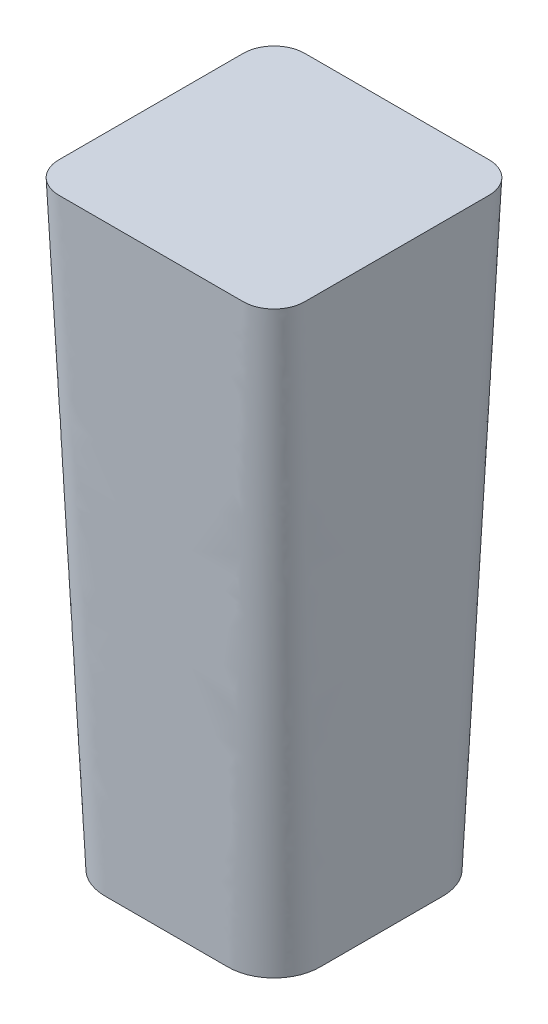
ISO-10303-21;
HEADER;
FILE_DESCRIPTION(('STEP AP214'),'2;1');
FILE_NAME('part.step','',(''),(''),'','','');
FILE_SCHEMA(('AUTOMOTIVE_DESIGN { 1 0 10303 214 1 1 1 1 }'));
ENDSEC;
DATA;
#1=APPLICATION_CONTEXT('core data for automotive mechanical design processes');
#2=APPLICATION_PROTOCOL_DEFINITION('international standard','automotive_design',2000,#1);
#3=PRODUCT_CONTEXT('',#1,'mechanical');
#4=PRODUCT('Part','Part','',(#3));
#5=PRODUCT_RELATED_PRODUCT_CATEGORY('part','',(#4));
#6=PRODUCT_DEFINITION_FORMATION('','',#4);
#7=PRODUCT_DEFINITION_CONTEXT('part definition',#1,'design');
#8=PRODUCT_DEFINITION('design','',#6,#7);
#9=PRODUCT_DEFINITION_SHAPE('','',#8);
#10=(LENGTH_UNIT() NAMED_UNIT(*) SI_UNIT(.MILLI.,.METRE.));
#11=(NAMED_UNIT(*) PLANE_ANGLE_UNIT() SI_UNIT($,.RADIAN.));
#12=(NAMED_UNIT(*) SI_UNIT($,.STERADIAN.) SOLID_ANGLE_UNIT());
#13=UNCERTAINTY_MEASURE_WITH_UNIT(LENGTH_MEASURE(1.E-05),#10,'distance_accuracy_value','');
#14=(GEOMETRIC_REPRESENTATION_CONTEXT(3) GLOBAL_UNCERTAINTY_ASSIGNED_CONTEXT((#13)) GLOBAL_UNIT_ASSIGNED_CONTEXT((#10,
#11,#12)) REPRESENTATION_CONTEXT('',''));
#15=CARTESIAN_POINT('',(0.,0.,0.));
#16=DIRECTION('',(0.,0.,1.));
#17=DIRECTION('',(1.,0.,0.));
#18=AXIS2_PLACEMENT_3D('',#15,#16,#17);
#19=CARTESIAN_POINT('',(-4.,-39.,4.));
#20=DIRECTION('',(0.,1.,0.));
#21=DIRECTION('',(0.,0.,1.));
#22=AXIS2_PLACEMENT_3D('',#19,#20,#21);
#23=PLANE('',#22);
#24=CARTESIAN_POINT('',(-4.,-39.,4.));
#25=DIRECTION('',(0.,1.,0.));
#26=DIRECTION('',(0.,0.,1.));
#27=AXIS2_PLACEMENT_3D('',#24,#25,#26);
#28=CIRCLE('',#27,3.);
#29=CARTESIAN_POINT('',(-7.,-39.,3.99999999999998));
#30=VERTEX_POINT('',#29);
#31=CARTESIAN_POINT('',(-3.99999999999998,-39.,7.));
#32=VERTEX_POINT('',#31);
#33=EDGE_CURVE('E306',#30,#32,#28,.T.);
#34=ORIENTED_EDGE('',*,*,#33,.F.);
#35=DIRECTION('',(0.,0.,1.));
#36=VECTOR('',#35,1.);
#37=CARTESIAN_POINT('',(-7.,-39.,-3.99999999999998));
#38=LINE('',#37,#36);
#39=CARTESIAN_POINT('',(-7.,-39.,-3.99999999999998));
#40=VERTEX_POINT('',#39);
#41=EDGE_CURVE('E12',#40,#30,#38,.T.);
#42=ORIENTED_EDGE('',*,*,#41,.F.);
#43=CARTESIAN_POINT('',(-4.,-39.,-4.));
#44=DIRECTION('',(0.,1.,0.));
#45=DIRECTION('',(0.,0.,1.));
#46=AXIS2_PLACEMENT_3D('',#43,#44,#45);
#47=CIRCLE('',#46,3.);
#48=CARTESIAN_POINT('',(-3.99999999999998,-39.,-7.));
#49=VERTEX_POINT('',#48);
#50=EDGE_CURVE('E238',#49,#40,#47,.T.);
#51=ORIENTED_EDGE('',*,*,#50,.F.);
#52=DIRECTION('',(1.,0.,0.));
#53=VECTOR('',#52,1.);
#54=CARTESIAN_POINT('',(-3.99999999999998,-39.,-7.));
#55=LINE('',#54,#53);
#56=CARTESIAN_POINT('',(3.99999999999998,-39.,-7.));
#57=VERTEX_POINT('',#56);
#58=EDGE_CURVE('E465',#49,#57,#55,.T.);
#59=ORIENTED_EDGE('',*,*,#58,.T.);
#60=CARTESIAN_POINT('',(4.,-39.,-4.));
#61=DIRECTION('',(0.,1.,0.));
#62=DIRECTION('',(0.,0.,1.));
#63=AXIS2_PLACEMENT_3D('',#60,#61,#62);
#64=CIRCLE('',#63,3.);
#65=CARTESIAN_POINT('',(7.,-39.,-3.99999999999998));
#66=VERTEX_POINT('',#65);
#67=EDGE_CURVE('E455',#66,#57,#64,.T.);
#68=ORIENTED_EDGE('',*,*,#67,.F.);
#69=DIRECTION('',(0.,0.,1.));
#70=VECTOR('',#69,1.);
#71=CARTESIAN_POINT('',(7.,-39.,-3.99999999999998));
#72=LINE('',#71,#70);
#73=CARTESIAN_POINT('',(7.,-39.,3.99999999999998));
#74=VERTEX_POINT('',#73);
#75=EDGE_CURVE('E443',#66,#74,#72,.T.);
#76=ORIENTED_EDGE('',*,*,#75,.T.);
#77=CARTESIAN_POINT('',(4.,-39.,4.));
#78=DIRECTION('',(0.,1.,0.));
#79=DIRECTION('',(0.,0.,1.));
#80=AXIS2_PLACEMENT_3D('',#77,#78,#79);
#81=CIRCLE('',#80,3.);
#82=CARTESIAN_POINT('',(3.99999999999998,-39.,7.));
#83=VERTEX_POINT('',#82);
#84=EDGE_CURVE('E428',#83,#74,#81,.T.);
#85=ORIENTED_EDGE('',*,*,#84,.F.);
#86=DIRECTION('',(1.,0.,0.));
#87=VECTOR('',#86,1.);
#88=CARTESIAN_POINT('',(-3.99999999999998,-39.,7.));
#89=LINE('',#88,#87);
#90=EDGE_CURVE('E416',#32,#83,#89,.T.);
#91=ORIENTED_EDGE('',*,*,#90,.F.);
#92=EDGE_LOOP('',(#34,#42,#51,#59,#68,#76,#85,#91));
#93=FACE_BOUND('',#92,.T.);
#94=ADVANCED_FACE('F229',(#93),#23,.F.);
#95=CARTESIAN_POINT('',(-6.,0.,6.));
#96=DIRECTION('',(0.,-1.,0.));
#97=DIRECTION('',(0.,0.,-1.));
#98=AXIS2_PLACEMENT_3D('',#95,#96,#97);
#99=PLANE('',#98);
#100=CARTESIAN_POINT('',(-6.,0.,6.));
#101=DIRECTION('',(0.,-1.,0.));
#102=DIRECTION('',(0.,0.,-1.));
#103=AXIS2_PLACEMENT_3D('',#100,#101,#102);
#104=CIRCLE('',#103,2.);
#105=CARTESIAN_POINT('',(-5.99999999999999,0.,8.));
#106=VERTEX_POINT('',#105);
#107=CARTESIAN_POINT('',(-8.,0.,5.99999999999999));
#108=VERTEX_POINT('',#107);
#109=EDGE_CURVE('E303',#106,#108,#104,.T.);
#110=ORIENTED_EDGE('',*,*,#109,.F.);
#111=DIRECTION('',(1.,0.,0.));
#112=VECTOR('',#111,1.);
#113=CARTESIAN_POINT('',(-5.99999999999999,0.,8.));
#114=LINE('',#113,#112);
#115=CARTESIAN_POINT('',(5.99999999999999,0.,8.));
#116=VERTEX_POINT('',#115);
#117=EDGE_CURVE('E298',#106,#116,#114,.T.);
#118=ORIENTED_EDGE('',*,*,#117,.T.);
#119=CARTESIAN_POINT('',(6.,0.,6.));
#120=DIRECTION('',(0.,1.,0.));
#121=DIRECTION('',(0.,0.,1.));
#122=AXIS2_PLACEMENT_3D('',#119,#120,#121);
#123=CIRCLE('',#122,2.);
#124=CARTESIAN_POINT('',(8.,0.,5.99999999999999));
#125=VERTEX_POINT('',#124);
#126=EDGE_CURVE('E305',#116,#125,#123,.T.);
#127=ORIENTED_EDGE('',*,*,#126,.T.);
#128=DIRECTION('',(0.,0.,1.));
#129=VECTOR('',#128,1.);
#130=CARTESIAN_POINT('',(8.,0.,-5.99999999999999));
#131=LINE('',#130,#129);
#132=CARTESIAN_POINT('',(8.,0.,-5.99999999999999));
#133=VERTEX_POINT('',#132);
#134=EDGE_CURVE('E386',#133,#125,#131,.T.);
#135=ORIENTED_EDGE('',*,*,#134,.F.);
#136=CARTESIAN_POINT('',(6.,0.,-6.));
#137=DIRECTION('',(0.,1.,0.));
#138=DIRECTION('',(0.,0.,1.));
#139=AXIS2_PLACEMENT_3D('',#136,#137,#138);
#140=CIRCLE('',#139,2.);
#141=CARTESIAN_POINT('',(5.99999999999999,0.,-8.));
#142=VERTEX_POINT('',#141);
#143=EDGE_CURVE('E383',#133,#142,#140,.T.);
#144=ORIENTED_EDGE('',*,*,#143,.T.);
#145=DIRECTION('',(1.,0.,0.));
#146=VECTOR('',#145,1.);
#147=CARTESIAN_POINT('',(-5.99999999999999,0.,-8.));
#148=LINE('',#147,#146);
#149=CARTESIAN_POINT('',(-5.99999999999999,0.,-8.));
#150=VERTEX_POINT('',#149);
#151=EDGE_CURVE('E378',#150,#142,#148,.T.);
#152=ORIENTED_EDGE('',*,*,#151,.F.);
#153=CARTESIAN_POINT('',(-6.,0.,-6.));
#154=DIRECTION('',(0.,1.,0.));
#155=DIRECTION('',(0.,0.,1.));
#156=AXIS2_PLACEMENT_3D('',#153,#154,#155);
#157=CIRCLE('',#156,2.);
#158=CARTESIAN_POINT('',(-8.,0.,-5.99999999999999));
#159=VERTEX_POINT('',#158);
#160=EDGE_CURVE('E376',#150,#159,#157,.T.);
#161=ORIENTED_EDGE('',*,*,#160,.T.);
#162=DIRECTION('',(0.,0.,1.));
#163=VECTOR('',#162,1.);
#164=CARTESIAN_POINT('',(-8.,0.,-5.99999999999999));
#165=LINE('',#164,#163);
#166=EDGE_CURVE('E313',#159,#108,#165,.T.);
#167=ORIENTED_EDGE('',*,*,#166,.T.);
#168=EDGE_LOOP('',(#110,#118,#127,#135,#144,#152,#161,#167));
#169=FACE_BOUND('',#168,.T.);
#170=ADVANCED_FACE('F315',(#169),#99,.F.);
#171=CARTESIAN_POINT('',(-5.99999999901379,0.,8.));
#172=CARTESIAN_POINT('',(-3.99999999917202,-39.,7.));
#173=CARTESIAN_POINT('',(-6.18238478103951,0.,8.));
#174=CARTESIAN_POINT('',(-4.15312433333273,-39.,7.));
#175=CARTESIAN_POINT('',(-6.48066479771046,0.,7.95499481573023));
#176=CARTESIAN_POINT('',(-4.47935929820773,-39.,6.97678912731977));
#177=CARTESIAN_POINT('',(-6.848061214367,0.,7.82423870663478));
#178=CARTESIAN_POINT('',(-5.02404497942996,-39.,6.84082888647453));
#179=CARTESIAN_POINT('',(-7.15680336671805,0.,7.6435190743447));
#180=CARTESIAN_POINT('',(-5.59850216324002,-39.,6.56785496894202));
#181=CARTESIAN_POINT('',(-7.42130284881761,0.,7.42130284881759));
#182=CARTESIAN_POINT('',(-6.14051440455841,-39.,6.1405144045584));
#183=CARTESIAN_POINT('',(-7.64351907434468,0.,7.15680336671807));
#184=CARTESIAN_POINT('',(-6.56785496894205,-39.0000000000001,5.59850216324001));
#185=CARTESIAN_POINT('',(-7.82423870663479,0.,6.84806121436698));
#186=CARTESIAN_POINT('',(-6.84082888647454,-38.9999999999999,5.02404497942993));
#187=CARTESIAN_POINT('',(-7.95499481573022,0.,6.48066479771048));
#188=CARTESIAN_POINT('',(-6.97678912731977,-39.,4.47935929820771));
#189=CARTESIAN_POINT('',(-8.,0.,6.18238478103951));
#190=CARTESIAN_POINT('',(-7.,-39.,4.15312433333271));
#191=CARTESIAN_POINT('',(-8.,0.,5.10297017665329));
#192=CARTESIAN_POINT('',(-7.,-39.,3.24688292029269));
#193=CARTESIAN_POINT('',(-8.,0.,3.18082361984502));
#194=CARTESIAN_POINT('',(-7.,-39.,1.89225139112458));
#195=CARTESIAN_POINT('',(-8.,0.,0.));
#196=CARTESIAN_POINT('',(-7.,-39.,0.));
#197=CARTESIAN_POINT('',(-8.,0.,-3.18082361984502));
#198=CARTESIAN_POINT('',(-7.,-39.,-1.89225139112457));
#199=CARTESIAN_POINT('',(-8.,0.,-5.10297017665329));
#200=CARTESIAN_POINT('',(-7.,-39.,-3.24688292029269));
#201=CARTESIAN_POINT('',(-8.,0.,-6.18238478103951));
#202=CARTESIAN_POINT('',(-7.,-39.,-4.15312433333271));
#203=CARTESIAN_POINT('',(-7.95499481573022,0.,-6.48066479771046));
#204=CARTESIAN_POINT('',(-6.97678912731977,-39.,-4.47935929820772));
#205=CARTESIAN_POINT('',(-7.8242387066348,0.,-6.848061214367));
#206=CARTESIAN_POINT('',(-6.84082888647453,-39.,-5.02404497942994));
#207=CARTESIAN_POINT('',(-7.64351907434467,0.,-7.15680336671805));
#208=CARTESIAN_POINT('',(-6.56785496894204,-39.,-5.59850216324001));
#209=CARTESIAN_POINT('',(-7.42130284881762,0.,-7.42130284881761));
#210=CARTESIAN_POINT('',(-6.1405144045584,-39.,-6.14051440455841));
#211=CARTESIAN_POINT('',(-7.15680336671804,0.,-7.64351907434467));
#212=CARTESIAN_POINT('',(-5.59850216324002,-39.,-6.56785496894204));
#213=CARTESIAN_POINT('',(-6.84806121436701,0.,-7.82423870663479));
#214=CARTESIAN_POINT('',(-5.02404497942994,-39.,-6.84082888647453));
#215=CARTESIAN_POINT('',(-6.48066479771046,0.,-7.95499481573023));
#216=CARTESIAN_POINT('',(-4.47935929820771,-39.,-6.97678912731977));
#217=CARTESIAN_POINT('',(-6.18238478103951,0.,-8.));
#218=CARTESIAN_POINT('',(-4.15312433333271,-39.,-7.));
#219=CARTESIAN_POINT('',(-5.10297017665329,0.,-8.));
#220=CARTESIAN_POINT('',(-3.24688292029269,-39.,-7.));
#221=CARTESIAN_POINT('',(-3.18082361984502,0.,-8.));
#222=CARTESIAN_POINT('',(-1.89225139112457,-39.,-7.));
#223=CARTESIAN_POINT('',(0.,0.,-8.));
#224=CARTESIAN_POINT('',(0.,-39.,-7.00000000000001));
#225=CARTESIAN_POINT('',(3.18082361984502,0.,-8.));
#226=CARTESIAN_POINT('',(1.89225139112458,-39.,-7.));
#227=CARTESIAN_POINT('',(5.1029701766533,0.,-8.));
#228=CARTESIAN_POINT('',(3.24688292029269,-39.,-7.));
#229=CARTESIAN_POINT('',(6.18238478103951,0.,-8.));
#230=CARTESIAN_POINT('',(4.15312433333271,-39.,-7.));
#231=CARTESIAN_POINT('',(6.48066479771047,0.,-7.95499481573023));
#232=CARTESIAN_POINT('',(4.47935929820772,-38.9999999999999,-6.97678912731976));
#233=CARTESIAN_POINT('',(6.84806121436701,0.,-7.82423870663479));
#234=CARTESIAN_POINT('',(5.02404497942994,-39.0000000000001,-6.84082888647454));
#235=CARTESIAN_POINT('',(7.15680336671805,0.,-7.64351907434467));
#236=CARTESIAN_POINT('',(5.59850216324002,-38.9999999999998,-6.56785496894203));
#237=CARTESIAN_POINT('',(7.42130284881761,0.,-7.42130284881762));
#238=CARTESIAN_POINT('',(6.14051440455839,-39.0000000000002,-6.14051440455841));
#239=CARTESIAN_POINT('',(7.64351907434469,0.,-7.15680336671805));
#240=CARTESIAN_POINT('',(6.56785496894205,-38.9999999999999,-5.59850216324002));
#241=CARTESIAN_POINT('',(7.82423870663478,0.,-6.84806121436699));
#242=CARTESIAN_POINT('',(6.84082888647452,-39.0000000000001,-5.02404497942994));
#243=CARTESIAN_POINT('',(7.95499481573023,0.,-6.48066479771047));
#244=CARTESIAN_POINT('',(6.97678912731978,-39.,-4.47935929820772));
#245=CARTESIAN_POINT('',(8.,0.,-6.18238478103951));
#246=CARTESIAN_POINT('',(7.,-39.,-4.15312433333271));
#247=CARTESIAN_POINT('',(8.,0.,-5.10297017665329));
#248=CARTESIAN_POINT('',(7.,-39.,-3.24688292029269));
#249=CARTESIAN_POINT('',(8.00000000000001,0.,-3.18082361984502));
#250=CARTESIAN_POINT('',(7.,-39.,-1.89225139112457));
#251=CARTESIAN_POINT('',(7.99999999999999,0.,0.));
#252=CARTESIAN_POINT('',(7.,-39.,0.));
#253=CARTESIAN_POINT('',(8.00000000000001,0.,3.18082361984502));
#254=CARTESIAN_POINT('',(7.,-39.,1.89225139112458));
#255=CARTESIAN_POINT('',(8.,0.,5.10297017665329));
#256=CARTESIAN_POINT('',(7.,-39.,3.24688292029269));
#257=CARTESIAN_POINT('',(8.,0.,6.18238478103951));
#258=CARTESIAN_POINT('',(7.,-39.,4.15312433333271));
#259=CARTESIAN_POINT('',(7.95499481573023,0.,6.48066479771046));
#260=CARTESIAN_POINT('',(6.97678912731978,-39.,4.47935929820772));
#261=CARTESIAN_POINT('',(7.82423870663479,0.,6.848061214367));
#262=CARTESIAN_POINT('',(6.84082888647453,-39.,5.02404497942992));
#263=CARTESIAN_POINT('',(7.64351907434467,0.,7.15680336671805));
#264=CARTESIAN_POINT('',(6.56785496894204,-39.,5.59850216324002));
#265=CARTESIAN_POINT('',(7.42130284881761,0.,7.42130284881761));
#266=CARTESIAN_POINT('',(6.1405144045584,-39.,6.1405144045584));
#267=CARTESIAN_POINT('',(7.15680336671805,0.,7.64351907434469));
#268=CARTESIAN_POINT('',(5.59850216324001,-38.9999999999999,6.56785496894204));
#269=CARTESIAN_POINT('',(6.84806121436699,0.,7.82423870663479));
#270=CARTESIAN_POINT('',(5.02404497942993,-39.,6.84082888647454));
#271=CARTESIAN_POINT('',(6.48066479771047,0.,7.95499481573023));
#272=CARTESIAN_POINT('',(4.47935929820771,-39.,6.97678912731977));
#273=CARTESIAN_POINT('',(6.18238478103951,0.,8.));
#274=CARTESIAN_POINT('',(4.15312433333271,-39.,7.));
#275=CARTESIAN_POINT('',(5.10297017665329,0.,8.));
#276=CARTESIAN_POINT('',(3.24688292029269,-39.,7.));
#277=CARTESIAN_POINT('',(3.18082361984502,0.,8.00000000000001));
#278=CARTESIAN_POINT('',(1.89225139112458,-38.9999999999999,7.));
#279=CARTESIAN_POINT('',(0.,0.,7.99999999999998));
#280=CARTESIAN_POINT('',(0.,-39.0000000000001,7.00000000000001));
#281=CARTESIAN_POINT('',(-3.18082361984501,0.,8.00000000000001));
#282=CARTESIAN_POINT('',(-1.89225139112457,-38.9999999999999,7.));
#283=CARTESIAN_POINT('',(-5.10297017665329,0.,8.));
#284=CARTESIAN_POINT('',(-3.24688292029269,-39.,7.));
#285=CARTESIAN_POINT('',(-5.99999999901379,0.,8.));
#286=CARTESIAN_POINT('',(-3.99999999917202,-39.,7.));
#287=B_SPLINE_SURFACE_WITH_KNOTS('',3,1,((#171,#172),(#173,#174),(#175,#176),(#177,#178),(#179,
#180),(#181,#182),(#183,#184),(#185,#186),(#187,#188),(#189,#190),(#191,#192),(#193,#194),(#195,
#196),(#197,#198),(#199,#200),(#201,#202),(#203,#204),(#205,#206),(#207,#208),(#209,#210),(#211,
#212),(#213,#214),(#215,#216),(#217,#218),(#219,#220),(#221,#222),(#223,#224),(#225,#226),(#227,
#228),(#229,#230),(#231,#232),(#233,#234),(#235,#236),(#237,#238),(#239,#240),(#241,#242),(#243,
#244),(#245,#246),(#247,#248),(#249,#250),(#251,#252),(#253,#254),(#255,#256),(#257,#258),(#259,
#260),(#261,#262),(#263,#264),(#265,#266),(#267,#268),(#269,#270),(#271,#272),(#273,#274),(#275,
#276),(#277,#278),(#279,#280),(#281,#282),(#283,#284),(#285,#286)),.UNSPECIFIED.,.T.,.F.,.F.,(4,
1,1,1,1,1,1,1,2,1,1,1,2,1,1,1,1,1,1,1,2,1,1,1,2,1,1,1,1,1,1,1,2,1,1,1,2,1,1,1,1,1,1,1,2,1,1,1,
4),(2,2),(0.,0.00903396292577197,0.0180679258515439,0.0271018887773159,0.0361358517030879,
0.0451698146288599,0.0542037775546319,0.0632377404804038,0.0722717034061758,0.116703777554632,
0.161135851703088,0.205567925851544,0.25,0.259033962925772,0.268067925851544,0.277101888777316,
0.286135851703088,0.29516981462886,0.304203777554632,0.313237740480404,0.322271703406176,
0.366703777554632,0.411135851703088,0.455567925851544,0.5,0.509033962925772,0.518067925851544,
0.527101888777316,0.536135851703088,0.54516981462886,0.554203777554632,0.563237740480404,
0.572271703406176,0.616703777554632,0.661135851703088,0.705567925851544,0.75,0.759033962925772,
0.768067925851544,0.777101888777316,0.786135851703088,0.79516981462886,0.804203777554632,
0.813237740480404,0.822271703406176,0.866703777554632,0.911135851703088,0.955567925851544,1.),
(0.,1.),.UNSPECIFIED.);
#288=CARTESIAN_POINT('',(8.,0.,0.));
#289=CARTESIAN_POINT('',(7.,-39.,0.));
#290=CARTESIAN_POINT('',(8.,0.,1.06027453994834));
#291=CARTESIAN_POINT('',(7.,-39.,0.630750463708191));
#292=CARTESIAN_POINT('',(8.00000000000001,0.,3.18082361984502));
#293=CARTESIAN_POINT('',(7.,-39.,1.89225139112458));
#294=CARTESIAN_POINT('',(8.,0.,5.10297017665329));
#295=CARTESIAN_POINT('',(7.,-39.,3.24688292029269));
#296=CARTESIAN_POINT('',(8.,0.,6.18238478103951));
#297=CARTESIAN_POINT('',(7.,-39.,4.15312433333271));
#298=CARTESIAN_POINT('',(7.95499481573023,0.,6.48066479771046));
#299=CARTESIAN_POINT('',(6.97678912731978,-39.,4.47935929820772));
#300=CARTESIAN_POINT('',(7.82423870663479,0.,6.848061214367));
#301=CARTESIAN_POINT('',(6.84082888647453,-39.,5.02404497942992));
#302=CARTESIAN_POINT('',(7.64351907434467,0.,7.15680336671805));
#303=CARTESIAN_POINT('',(6.56785496894204,-39.,5.59850216324002));
#304=CARTESIAN_POINT('',(7.42130284881761,0.,7.42130284881761));
#305=CARTESIAN_POINT('',(6.1405144045584,-39.,6.1405144045584));
#306=CARTESIAN_POINT('',(7.15680336671805,0.,7.64351907434469));
#307=CARTESIAN_POINT('',(5.59850216324001,-38.9999999999999,6.56785496894204));
#308=CARTESIAN_POINT('',(6.84806121436699,0.,7.82423870663479));
#309=CARTESIAN_POINT('',(5.02404497942993,-39.,6.84082888647454));
#310=CARTESIAN_POINT('',(6.48066479771047,0.,7.95499481573023));
#311=CARTESIAN_POINT('',(4.47935929820771,-39.,6.97678912731977));
#312=CARTESIAN_POINT('',(6.18238478103951,0.,8.));
#313=CARTESIAN_POINT('',(4.15312433333271,-39.,7.));
#314=CARTESIAN_POINT('',(5.10297017665329,0.,8.));
#315=CARTESIAN_POINT('',(3.24688292029269,-39.,7.));
#316=CARTESIAN_POINT('',(3.18082361984502,0.,8.00000000000001));
#317=CARTESIAN_POINT('',(1.89225139112458,-38.9999999999999,7.));
#318=CARTESIAN_POINT('',(0.,0.,7.99999999999998));
#319=CARTESIAN_POINT('',(0.,-39.0000000000001,7.00000000000001));
#320=CARTESIAN_POINT('',(-3.18082361984501,0.,8.00000000000001));
#321=CARTESIAN_POINT('',(-1.89225139112457,-38.9999999999999,7.));
#322=CARTESIAN_POINT('',(-5.10297017665329,0.,8.));
#323=CARTESIAN_POINT('',(-3.24688292029269,-39.,7.));
#324=CARTESIAN_POINT('',(-6.18238478103951,0.,8.));
#325=CARTESIAN_POINT('',(-4.15312433333273,-39.,7.));
#326=CARTESIAN_POINT('',(-6.48066479771046,0.,7.95499481573023));
#327=CARTESIAN_POINT('',(-4.47935929820773,-39.,6.97678912731977));
#328=CARTESIAN_POINT('',(-6.848061214367,0.,7.82423870663478));
#329=CARTESIAN_POINT('',(-5.02404497942996,-39.,6.84082888647453));
#330=CARTESIAN_POINT('',(-7.15680336671805,0.,7.6435190743447));
#331=CARTESIAN_POINT('',(-5.59850216324002,-39.,6.56785496894202));
#332=CARTESIAN_POINT('',(-7.42130284881761,0.,7.42130284881759));
#333=CARTESIAN_POINT('',(-6.14051440455841,-39.,6.1405144045584));
#334=CARTESIAN_POINT('',(-7.64351907434468,0.,7.15680336671807));
#335=CARTESIAN_POINT('',(-6.56785496894205,-39.0000000000001,5.59850216324001));
#336=CARTESIAN_POINT('',(-7.82423870663479,0.,6.84806121436698));
#337=CARTESIAN_POINT('',(-6.84082888647454,-38.9999999999999,5.02404497942993));
#338=CARTESIAN_POINT('',(-7.95499481573022,0.,6.48066479771048));
#339=CARTESIAN_POINT('',(-6.97678912731977,-39.,4.47935929820771));
#340=CARTESIAN_POINT('',(-8.,0.,6.18238478103951));
#341=CARTESIAN_POINT('',(-7.,-39.,4.15312433333271));
#342=CARTESIAN_POINT('',(-8.,0.,5.10297017665329));
#343=CARTESIAN_POINT('',(-7.,-39.,3.24688292029269));
#344=CARTESIAN_POINT('',(-8.,0.,3.18082361984502));
#345=CARTESIAN_POINT('',(-7.,-39.,1.89225139112458));
#346=CARTESIAN_POINT('',(-8.,0.,0.));
#347=CARTESIAN_POINT('',(-7.,-39.,0.));
#348=CARTESIAN_POINT('',(-8.,0.,-3.18082361984502));
#349=CARTESIAN_POINT('',(-7.,-39.,-1.89225139112457));
#350=CARTESIAN_POINT('',(-8.,0.,-5.10297017665329));
#351=CARTESIAN_POINT('',(-7.,-39.,-3.24688292029269));
#352=CARTESIAN_POINT('',(-8.,0.,-6.18238478103951));
#353=CARTESIAN_POINT('',(-7.,-39.,-4.15312433333271));
#354=CARTESIAN_POINT('',(-7.95499481573022,0.,-6.48066479771046));
#355=CARTESIAN_POINT('',(-6.97678912731977,-39.,-4.47935929820772));
#356=CARTESIAN_POINT('',(-7.8242387066348,0.,-6.848061214367));
#357=CARTESIAN_POINT('',(-6.84082888647453,-39.,-5.02404497942994));
#358=CARTESIAN_POINT('',(-7.64351907434467,0.,-7.15680336671805));
#359=CARTESIAN_POINT('',(-6.56785496894204,-39.,-5.59850216324001));
#360=CARTESIAN_POINT('',(-7.42130284881762,0.,-7.42130284881761));
#361=CARTESIAN_POINT('',(-6.1405144045584,-39.,-6.14051440455841));
#362=CARTESIAN_POINT('',(-7.15680336671804,0.,-7.64351907434467));
#363=CARTESIAN_POINT('',(-5.59850216324002,-39.,-6.56785496894204));
#364=CARTESIAN_POINT('',(-6.84806121436701,0.,-7.82423870663479));
#365=CARTESIAN_POINT('',(-5.02404497942994,-39.,-6.84082888647453));
#366=CARTESIAN_POINT('',(-6.48066479771046,0.,-7.95499481573023));
#367=CARTESIAN_POINT('',(-4.47935929820771,-39.,-6.97678912731977));
#368=CARTESIAN_POINT('',(-6.18238478103951,0.,-8.));
#369=CARTESIAN_POINT('',(-4.15312433333271,-39.,-7.));
#370=CARTESIAN_POINT('',(-5.10297017665329,0.,-8.));
#371=CARTESIAN_POINT('',(-3.24688292029269,-39.,-7.));
#372=CARTESIAN_POINT('',(-3.18082361984502,0.,-8.));
#373=CARTESIAN_POINT('',(-1.89225139112457,-39.,-7.));
#374=CARTESIAN_POINT('',(0.,0.,-8.));
#375=CARTESIAN_POINT('',(0.,-39.,-7.00000000000001));
#376=CARTESIAN_POINT('',(3.18082361984502,0.,-8.));
#377=CARTESIAN_POINT('',(1.89225139112458,-39.,-7.));
#378=CARTESIAN_POINT('',(5.1029701766533,0.,-8.));
#379=CARTESIAN_POINT('',(3.24688292029269,-39.,-7.));
#380=CARTESIAN_POINT('',(6.18238478103951,0.,-8.));
#381=CARTESIAN_POINT('',(4.15312433333271,-39.,-7.));
#382=CARTESIAN_POINT('',(6.48066479771047,0.,-7.95499481573023));
#383=CARTESIAN_POINT('',(4.47935929820772,-38.9999999999999,-6.97678912731976));
#384=CARTESIAN_POINT('',(6.84806121436701,0.,-7.82423870663479));
#385=CARTESIAN_POINT('',(5.02404497942994,-39.0000000000001,-6.84082888647454));
#386=CARTESIAN_POINT('',(7.15680336671805,0.,-7.64351907434467));
#387=CARTESIAN_POINT('',(5.59850216324002,-38.9999999999998,-6.56785496894203));
#388=CARTESIAN_POINT('',(7.42130284881761,0.,-7.42130284881762));
#389=CARTESIAN_POINT('',(6.14051440455839,-39.0000000000002,-6.14051440455841));
#390=CARTESIAN_POINT('',(7.64351907434469,0.,-7.15680336671805));
#391=CARTESIAN_POINT('',(6.56785496894205,-38.9999999999999,-5.59850216324002));
#392=CARTESIAN_POINT('',(7.82423870663478,0.,-6.84806121436699));
#393=CARTESIAN_POINT('',(6.84082888647452,-39.0000000000001,-5.02404497942994));
#394=CARTESIAN_POINT('',(7.95499481573023,0.,-6.48066479771047));
#395=CARTESIAN_POINT('',(6.97678912731978,-39.,-4.47935929820772));
#396=CARTESIAN_POINT('',(8.,0.,-6.18238478103951));
#397=CARTESIAN_POINT('',(7.,-39.,-4.15312433333271));
#398=CARTESIAN_POINT('',(8.,0.,-5.10297017665329));
#399=CARTESIAN_POINT('',(7.,-39.,-3.24688292029269));
#400=CARTESIAN_POINT('',(8.00000000000001,0.,-3.18082361984502));
#401=CARTESIAN_POINT('',(7.,-39.,-1.89225139112457));
#402=CARTESIAN_POINT('',(8.,0.,-1.06027453994834));
#403=CARTESIAN_POINT('',(7.,-39.,-0.630750463708194));
#404=CARTESIAN_POINT('',(8.,0.,0.));
#405=CARTESIAN_POINT('',(7.,-39.,0.));
#406=B_SPLINE_SURFACE_WITH_KNOTS('',3,1,((#288,#289),(#290,#291),(#292,#293),(#294,#295),(#296,
#297),(#298,#299),(#300,#301),(#302,#303),(#304,#305),(#306,#307),(#308,#309),(#310,#311),(#312,
#313),(#314,#315),(#316,#317),(#318,#319),(#320,#321),(#322,#323),(#324,#325),(#326,#327),(#328,
#329),(#330,#331),(#332,#333),(#334,#335),(#336,#337),(#338,#339),(#340,#341),(#342,#343),(#344,
#345),(#346,#347),(#348,#349),(#350,#351),(#352,#353),(#354,#355),(#356,#357),(#358,#359),(#360,
#361),(#362,#363),(#364,#365),(#366,#367),(#368,#369),(#370,#371),(#372,#373),(#374,#375),(#376,
#377),(#378,#379),(#380,#381),(#382,#383),(#384,#385),(#386,#387),(#388,#389),(#390,#391),(#392,
#393),(#394,#395),(#396,#397),(#398,#399),(#400,#401),(#402,#403),(#404,#405)),.UNSPECIFIED.,
.T.,.F.,.F.,(4,1,2,1,1,1,1,1,1,1,2,1,1,1,2,1,1,1,1,1,1,1,2,1,1,1,2,1,1,1,1,1,1,1,2,1,1,1,2,1,1,
1,1,1,1,1,2,1,4),(2,2),(0.661135851703088,0.705567925851544,0.75,0.759033962925772,
0.768067925851544,0.777101888777316,0.786135851703088,0.79516981462886,0.804203777554632,
0.813237740480404,0.822271703406176,0.866703777554632,0.911135851703088,0.955567925851544,1.,
1.00903396292577,1.01806792585154,1.02710188877732,1.03613585170309,1.04516981462886,
1.05420377755463,1.0632377404804,1.07227170340618,1.11670377755463,1.16113585170309,
1.20556792585154,1.25,1.25903396292577,1.26806792585154,1.27710188877732,1.28613585170309,
1.29516981462886,1.30420377755463,1.3132377404804,1.32227170340618,1.36670377755463,
1.41113585170309,1.45556792585154,1.5,1.50903396292577,1.51806792585154,1.52710188877732,
1.53613585170309,1.54516981462886,1.55420377755463,1.5632377404804,1.57227170340618,
1.61670377755463,1.66113585170309),(0.,1.),.UNSPECIFIED.);
#407=ORIENTED_EDGE('',*,*,#109,.T.);
#408=ORIENTED_EDGE('',*,*,#166,.F.);
#409=ORIENTED_EDGE('',*,*,#160,.F.);
#410=ORIENTED_EDGE('',*,*,#151,.T.);
#411=ORIENTED_EDGE('',*,*,#143,.F.);
#412=ORIENTED_EDGE('',*,*,#134,.T.);
#413=ORIENTED_EDGE('',*,*,#126,.F.);
#414=ORIENTED_EDGE('',*,*,#117,.F.);
#415=EDGE_LOOP('',(#407,#408,#409,#410,#411,#412,#413,#414));
#416=FACE_BOUND('',#415,.T.);
#417=ORIENTED_EDGE('',*,*,#41,.T.);
#418=ORIENTED_EDGE('',*,*,#33,.T.);
#419=ORIENTED_EDGE('',*,*,#90,.T.);
#420=ORIENTED_EDGE('',*,*,#84,.T.);
#421=ORIENTED_EDGE('',*,*,#75,.F.);
#422=ORIENTED_EDGE('',*,*,#67,.T.);
#423=ORIENTED_EDGE('',*,*,#58,.F.);
#424=ORIENTED_EDGE('',*,*,#50,.T.);
#425=EDGE_LOOP('',(#417,#418,#419,#420,#421,#422,#423,#424));
#426=FACE_BOUND('',#425,.T.);
#427=ADVANCED_FACE('F299',(#416,#426),#406,.T.);
#428=CLOSED_SHELL('',(#94,#170,#427));
#429=MANIFOLD_SOLID_BREP('B2',#428);
#430=ADVANCED_BREP_SHAPE_REPRESENTATION('',(#18,#429),#14);
#431=SHAPE_DEFINITION_REPRESENTATION(#9,#430);
ENDSEC;
END-ISO-10303-21;
